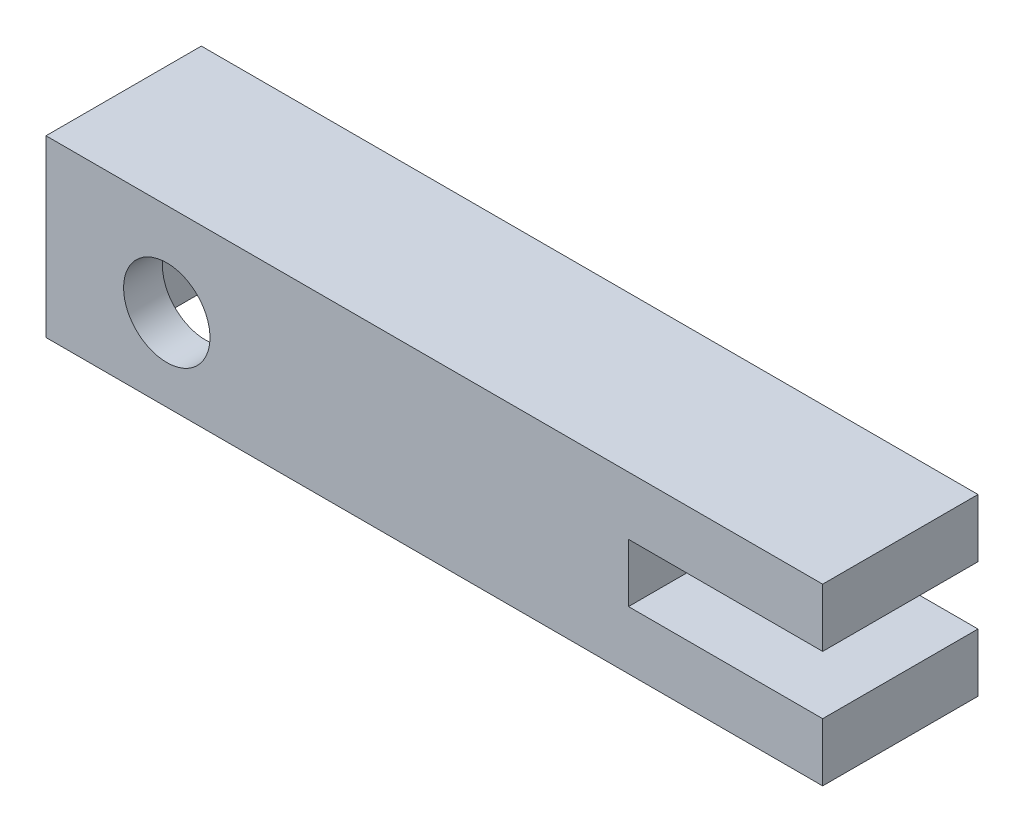
ISO-10303-21;
HEADER;
FILE_DESCRIPTION(('STEP AP214'),'2;1');
FILE_NAME('part.step','',(''),(''),'','','');
FILE_SCHEMA(('AUTOMOTIVE_DESIGN { 1 0 10303 214 1 1 1 1 }'));
ENDSEC;
DATA;
#1=APPLICATION_CONTEXT('core data for automotive mechanical design processes');
#2=APPLICATION_PROTOCOL_DEFINITION('international standard','automotive_design',2000,#1);
#3=PRODUCT_CONTEXT('',#1,'mechanical');
#4=PRODUCT('Part','Part','',(#3));
#5=PRODUCT_RELATED_PRODUCT_CATEGORY('part','',(#4));
#6=PRODUCT_DEFINITION_FORMATION('','',#4);
#7=PRODUCT_DEFINITION_CONTEXT('part definition',#1,'design');
#8=PRODUCT_DEFINITION('design','',#6,#7);
#9=PRODUCT_DEFINITION_SHAPE('','',#8);
#10=(LENGTH_UNIT() NAMED_UNIT(*) SI_UNIT(.MILLI.,.METRE.));
#11=(NAMED_UNIT(*) PLANE_ANGLE_UNIT() SI_UNIT($,.RADIAN.));
#12=(NAMED_UNIT(*) SI_UNIT($,.STERADIAN.) SOLID_ANGLE_UNIT());
#13=UNCERTAINTY_MEASURE_WITH_UNIT(LENGTH_MEASURE(1.E-05),#10,'distance_accuracy_value','');
#14=(GEOMETRIC_REPRESENTATION_CONTEXT(3) GLOBAL_UNCERTAINTY_ASSIGNED_CONTEXT((#13)) GLOBAL_UNIT_ASSIGNED_CONTEXT((#10,
#11,#12)) REPRESENTATION_CONTEXT('',''));
#15=CARTESIAN_POINT('',(0.,0.,0.));
#16=DIRECTION('',(0.,0.,1.));
#17=DIRECTION('',(1.,0.,0.));
#18=AXIS2_PLACEMENT_3D('',#15,#16,#17);
#19=CARTESIAN_POINT('',(-175.,45.,-20.));
#20=DIRECTION('',(0.,0.,1.));
#21=DIRECTION('',(1.,0.,0.));
#22=AXIS2_PLACEMENT_3D('',#19,#20,#21);
#23=PLANE('',#22);
#24=DIRECTION('',(0.,1.,0.));
#25=VECTOR('',#24,1.);
#26=CARTESIAN_POINT('',(25.,0.,-20.));
#27=LINE('',#26,#25);
#28=CARTESIAN_POINT('',(25.,30.,-20.));
#29=VERTEX_POINT('',#28);
#30=CARTESIAN_POINT('',(25.,45.,-20.));
#31=VERTEX_POINT('',#30);
#32=EDGE_CURVE('E59',#29,#31,#27,.T.);
#33=ORIENTED_EDGE('',*,*,#32,.F.);
#34=DIRECTION('',(1.,0.,0.));
#35=VECTOR('',#34,1.);
#36=CARTESIAN_POINT('',(0.,30.,-20.));
#37=LINE('',#36,#35);
#38=CARTESIAN_POINT('',(-25.,30.,-20.));
#39=VERTEX_POINT('',#38);
#40=EDGE_CURVE('E134',#39,#29,#37,.T.);
#41=ORIENTED_EDGE('',*,*,#40,.F.);
#42=DIRECTION('',(0.,1.,0.));
#43=VECTOR('',#42,1.);
#44=CARTESIAN_POINT('',(-25.,0.,-20.));
#45=LINE('',#44,#43);
#46=CARTESIAN_POINT('',(-25.,15.,-20.));
#47=VERTEX_POINT('',#46);
#48=EDGE_CURVE('E143',#47,#39,#45,.T.);
#49=ORIENTED_EDGE('',*,*,#48,.F.);
#50=DIRECTION('',(-1.,0.,0.));
#51=VECTOR('',#50,1.);
#52=CARTESIAN_POINT('',(0.,15.,-20.));
#53=LINE('',#52,#51);
#54=CARTESIAN_POINT('',(25.,15.,-20.));
#55=VERTEX_POINT('',#54);
#56=EDGE_CURVE('E165',#55,#47,#53,.T.);
#57=ORIENTED_EDGE('',*,*,#56,.F.);
#58=DIRECTION('',(0.,1.,0.));
#59=VECTOR('',#58,1.);
#60=CARTESIAN_POINT('',(25.,0.,-20.));
#61=LINE('',#60,#59);
#62=CARTESIAN_POINT('',(25.,0.,-20.));
#63=VERTEX_POINT('',#62);
#64=EDGE_CURVE('E150',#63,#55,#61,.T.);
#65=ORIENTED_EDGE('',*,*,#64,.F.);
#66=DIRECTION('',(-1.,0.,0.));
#67=VECTOR('',#66,1.);
#68=CARTESIAN_POINT('',(-175.,0.,-20.));
#69=LINE('',#68,#67);
#70=CARTESIAN_POINT('',(-122.8,0.,-20.));
#71=VERTEX_POINT('',#70);
#72=EDGE_CURVE('E254',#63,#71,#69,.T.);
#73=ORIENTED_EDGE('',*,*,#72,.T.);
#74=DIRECTION('',(0.,1.,0.));
#75=VECTOR('',#74,1.);
#76=CARTESIAN_POINT('',(-122.8,0.,-20.));
#77=LINE('',#76,#75);
#78=CARTESIAN_POINT('',(-122.8,42.2,-20.));
#79=VERTEX_POINT('',#78);
#80=EDGE_CURVE('E211',#71,#79,#77,.T.);
#81=ORIENTED_EDGE('',*,*,#80,.T.);
#82=DIRECTION('',(-1.,0.,0.));
#83=VECTOR('',#82,1.);
#84=CARTESIAN_POINT('',(-165.,42.2,-20.));
#85=LINE('',#84,#83);
#86=CARTESIAN_POINT('',(-165.,42.2,-20.));
#87=VERTEX_POINT('',#86);
#88=EDGE_CURVE('E224',#79,#87,#85,.T.);
#89=ORIENTED_EDGE('',*,*,#88,.T.);
#90=DIRECTION('',(0.,-1.,0.));
#91=VECTOR('',#90,1.);
#92=CARTESIAN_POINT('',(-165.,0.,-20.));
#93=LINE('',#92,#91);
#94=CARTESIAN_POINT('',(-165.,0.,-20.));
#95=VERTEX_POINT('',#94);
#96=EDGE_CURVE('E205',#87,#95,#93,.T.);
#97=ORIENTED_EDGE('',*,*,#96,.T.);
#98=CARTESIAN_POINT('',(-175.,0.,-20.));
#99=VERTEX_POINT('',#98);
#100=EDGE_CURVE('E234',#95,#99,#69,.T.);
#101=ORIENTED_EDGE('',*,*,#100,.T.);
#102=DIRECTION('',(0.,-1.,0.));
#103=VECTOR('',#102,1.);
#104=CARTESIAN_POINT('',(-175.,45.,-20.));
#105=LINE('',#104,#103);
#106=CARTESIAN_POINT('',(-175.,45.,-20.));
#107=VERTEX_POINT('',#106);
#108=EDGE_CURVE('E11',#107,#99,#105,.T.);
#109=ORIENTED_EDGE('',*,*,#108,.F.);
#110=DIRECTION('',(-1.,0.,0.));
#111=VECTOR('',#110,1.);
#112=CARTESIAN_POINT('',(-175.,45.,-20.));
#113=LINE('',#112,#111);
#114=EDGE_CURVE('E154',#31,#107,#113,.T.);
#115=ORIENTED_EDGE('',*,*,#114,.F.);
#116=EDGE_LOOP('',(#33,#41,#49,#57,#65,#73,#81,#89,#97,#101,#109,#115));
#117=FACE_BOUND('',#116,.T.);
#118=ADVANCED_FACE('F44',(#117),#23,.F.);
#119=CARTESIAN_POINT('',(0.,0.,0.));
#120=DIRECTION('',(0.,-1.,0.));
#121=DIRECTION('',(0.,0.,-1.));
#122=AXIS2_PLACEMENT_3D('',#119,#120,#121);
#123=PLANE('',#122);
#124=ORIENTED_EDGE('',*,*,#72,.F.);
#125=DIRECTION('',(0.,0.,1.));
#126=VECTOR('',#125,1.);
#127=CARTESIAN_POINT('',(25.,0.,-20.));
#128=LINE('',#127,#126);
#129=CARTESIAN_POINT('',(25.,0.,20.));
#130=VERTEX_POINT('',#129);
#131=EDGE_CURVE('E186',#63,#130,#128,.T.);
#132=ORIENTED_EDGE('',*,*,#131,.T.);
#133=DIRECTION('',(1.,0.,0.));
#134=VECTOR('',#133,1.);
#135=CARTESIAN_POINT('',(-175.,0.,20.));
#136=LINE('',#135,#134);
#137=CARTESIAN_POINT('',(-175.,0.,20.));
#138=VERTEX_POINT('',#137);
#139=EDGE_CURVE('E247',#138,#130,#136,.T.);
#140=ORIENTED_EDGE('',*,*,#139,.F.);
#141=DIRECTION('',(0.,0.,1.));
#142=VECTOR('',#141,1.);
#143=CARTESIAN_POINT('',(-175.,0.,20.));
#144=LINE('',#143,#142);
#145=EDGE_CURVE('E257',#99,#138,#144,.T.);
#146=ORIENTED_EDGE('',*,*,#145,.F.);
#147=ORIENTED_EDGE('',*,*,#100,.F.);
#148=DIRECTION('',(0.,0.,-1.));
#149=VECTOR('',#148,1.);
#150=CARTESIAN_POINT('',(-165.,0.,10.));
#151=LINE('',#150,#149);
#152=CARTESIAN_POINT('',(-165.,0.,10.));
#153=VERTEX_POINT('',#152);
#154=EDGE_CURVE('E231',#153,#95,#151,.T.);
#155=ORIENTED_EDGE('',*,*,#154,.F.);
#156=DIRECTION('',(1.,0.,0.));
#157=VECTOR('',#156,1.);
#158=CARTESIAN_POINT('',(-165.,0.,10.));
#159=LINE('',#158,#157);
#160=CARTESIAN_POINT('',(-122.8,0.,10.));
#161=VERTEX_POINT('',#160);
#162=EDGE_CURVE('E216',#153,#161,#159,.T.);
#163=ORIENTED_EDGE('',*,*,#162,.T.);
#164=DIRECTION('',(0.,0.,-1.));
#165=VECTOR('',#164,1.);
#166=CARTESIAN_POINT('',(-122.8,0.,10.));
#167=LINE('',#166,#165);
#168=EDGE_CURVE('E235',#161,#71,#167,.T.);
#169=ORIENTED_EDGE('',*,*,#168,.T.);
#170=EDGE_LOOP('',(#124,#132,#140,#146,#147,#155,#163,#169));
#171=FACE_BOUND('',#170,.T.);
#172=ADVANCED_FACE('F274',(#171),#123,.T.);
#173=CARTESIAN_POINT('',(-175.,45.,20.));
#174=DIRECTION('',(0.,0.,-1.));
#175=DIRECTION('',(-1.,0.,0.));
#176=AXIS2_PLACEMENT_3D('',#173,#174,#175);
#177=PLANE('',#176);
#178=CARTESIAN_POINT('',(-143.9,21.1,20.));
#179=DIRECTION('',(0.,0.,-1.));
#180=DIRECTION('',(-1.,0.,0.));
#181=AXIS2_PLACEMENT_3D('',#178,#179,#180);
#182=CIRCLE('',#181,11.125);
#183=CARTESIAN_POINT('',(-155.025,21.1,20.));
#184=VERTEX_POINT('',#183);
#185=EDGE_CURVE('E201',#184,#184,#182,.F.);
#186=ORIENTED_EDGE('',*,*,#185,.F.);
#187=EDGE_LOOP('',(#186));
#188=FACE_BOUND('',#187,.T.);
#189=DIRECTION('',(0.,1.,0.));
#190=VECTOR('',#189,1.);
#191=CARTESIAN_POINT('',(25.,0.,20.));
#192=LINE('',#191,#190);
#193=CARTESIAN_POINT('',(25.,30.,20.));
#194=VERTEX_POINT('',#193);
#195=CARTESIAN_POINT('',(25.,45.,20.));
#196=VERTEX_POINT('',#195);
#197=EDGE_CURVE('E147',#194,#196,#192,.T.);
#198=ORIENTED_EDGE('',*,*,#197,.T.);
#199=DIRECTION('',(1.,0.,0.));
#200=VECTOR('',#199,1.);
#201=CARTESIAN_POINT('',(-175.,45.,20.));
#202=LINE('',#201,#200);
#203=CARTESIAN_POINT('',(-175.,45.,20.));
#204=VERTEX_POINT('',#203);
#205=EDGE_CURVE('E250',#204,#196,#202,.T.);
#206=ORIENTED_EDGE('',*,*,#205,.F.);
#207=DIRECTION('',(0.,-1.,0.));
#208=VECTOR('',#207,1.);
#209=CARTESIAN_POINT('',(-175.,45.,20.));
#210=LINE('',#209,#208);
#211=EDGE_CURVE('E52',#204,#138,#210,.T.);
#212=ORIENTED_EDGE('',*,*,#211,.T.);
#213=ORIENTED_EDGE('',*,*,#139,.T.);
#214=DIRECTION('',(0.,1.,0.));
#215=VECTOR('',#214,1.);
#216=CARTESIAN_POINT('',(25.,0.,20.));
#217=LINE('',#216,#215);
#218=CARTESIAN_POINT('',(25.,15.,20.));
#219=VERTEX_POINT('',#218);
#220=EDGE_CURVE('E156',#130,#219,#217,.T.);
#221=ORIENTED_EDGE('',*,*,#220,.T.);
#222=DIRECTION('',(-1.,0.,0.));
#223=VECTOR('',#222,1.);
#224=CARTESIAN_POINT('',(0.,15.,20.));
#225=LINE('',#224,#223);
#226=CARTESIAN_POINT('',(-25.,15.,20.));
#227=VERTEX_POINT('',#226);
#228=EDGE_CURVE('E160',#219,#227,#225,.T.);
#229=ORIENTED_EDGE('',*,*,#228,.T.);
#230=DIRECTION('',(0.,1.,0.));
#231=VECTOR('',#230,1.);
#232=CARTESIAN_POINT('',(-25.,0.,20.));
#233=LINE('',#232,#231);
#234=CARTESIAN_POINT('',(-25.,30.,20.));
#235=VERTEX_POINT('',#234);
#236=EDGE_CURVE('E175',#227,#235,#233,.T.);
#237=ORIENTED_EDGE('',*,*,#236,.T.);
#238=DIRECTION('',(1.,0.,0.));
#239=VECTOR('',#238,1.);
#240=CARTESIAN_POINT('',(0.,30.,20.));
#241=LINE('',#240,#239);
#242=EDGE_CURVE('E172',#235,#194,#241,.T.);
#243=ORIENTED_EDGE('',*,*,#242,.T.);
#244=EDGE_LOOP('',(#198,#206,#212,#213,#221,#229,#237,#243));
#245=FACE_BOUND('',#244,.T.);
#246=ADVANCED_FACE('F268',(#188,#245),#177,.F.);
#247=CARTESIAN_POINT('',(0.,45.,0.));
#248=DIRECTION('',(0.,-1.,0.));
#249=DIRECTION('',(0.,0.,-1.));
#250=AXIS2_PLACEMENT_3D('',#247,#248,#249);
#251=PLANE('',#250);
#252=DIRECTION('',(0.,0.,1.));
#253=VECTOR('',#252,1.);
#254=CARTESIAN_POINT('',(25.,45.,-20.));
#255=LINE('',#254,#253);
#256=EDGE_CURVE('E182',#31,#196,#255,.T.);
#257=ORIENTED_EDGE('',*,*,#256,.F.);
#258=ORIENTED_EDGE('',*,*,#114,.T.);
#259=DIRECTION('',(0.,0.,1.));
#260=VECTOR('',#259,1.);
#261=CARTESIAN_POINT('',(-175.,45.,20.));
#262=LINE('',#261,#260);
#263=EDGE_CURVE('E246',#107,#204,#262,.T.);
#264=ORIENTED_EDGE('',*,*,#263,.T.);
#265=ORIENTED_EDGE('',*,*,#205,.T.);
#266=EDGE_LOOP('',(#257,#258,#264,#265));
#267=FACE_BOUND('',#266,.T.);
#268=ADVANCED_FACE('F290',(#267),#251,.F.);
#269=CARTESIAN_POINT('',(-175.,45.,20.));
#270=DIRECTION('',(1.,0.,0.));
#271=DIRECTION('',(0.,0.,-1.));
#272=AXIS2_PLACEMENT_3D('',#269,#270,#271);
#273=PLANE('',#272);
#274=ORIENTED_EDGE('',*,*,#145,.T.);
#275=ORIENTED_EDGE('',*,*,#211,.F.);
#276=ORIENTED_EDGE('',*,*,#263,.F.);
#277=ORIENTED_EDGE('',*,*,#108,.T.);
#278=EDGE_LOOP('',(#274,#275,#276,#277));
#279=FACE_BOUND('',#278,.T.);
#280=ADVANCED_FACE('F291',(#279),#273,.F.);
#281=CARTESIAN_POINT('',(-165.,0.,10.));
#282=DIRECTION('',(1.,0.,0.));
#283=DIRECTION('',(0.,0.,-1.));
#284=AXIS2_PLACEMENT_3D('',#281,#282,#283);
#285=PLANE('',#284);
#286=ORIENTED_EDGE('',*,*,#96,.F.);
#287=DIRECTION('',(0.,0.,-1.));
#288=VECTOR('',#287,1.);
#289=CARTESIAN_POINT('',(-165.,42.2,10.));
#290=LINE('',#289,#288);
#291=CARTESIAN_POINT('',(-165.,42.2,10.));
#292=VERTEX_POINT('',#291);
#293=EDGE_CURVE('E220',#292,#87,#290,.T.);
#294=ORIENTED_EDGE('',*,*,#293,.F.);
#295=DIRECTION('',(0.,-1.,0.));
#296=VECTOR('',#295,1.);
#297=CARTESIAN_POINT('',(-165.,0.,10.));
#298=LINE('',#297,#296);
#299=EDGE_CURVE('E206',#292,#153,#298,.T.);
#300=ORIENTED_EDGE('',*,*,#299,.T.);
#301=ORIENTED_EDGE('',*,*,#154,.T.);
#302=EDGE_LOOP('',(#286,#294,#300,#301));
#303=FACE_BOUND('',#302,.T.);
#304=ADVANCED_FACE('F296',(#303),#285,.T.);
#305=CARTESIAN_POINT('',(-122.8,0.,10.));
#306=DIRECTION('',(-1.,0.,0.));
#307=DIRECTION('',(0.,0.,1.));
#308=AXIS2_PLACEMENT_3D('',#305,#306,#307);
#309=PLANE('',#308);
#310=ORIENTED_EDGE('',*,*,#80,.F.);
#311=ORIENTED_EDGE('',*,*,#168,.F.);
#312=DIRECTION('',(0.,1.,0.));
#313=VECTOR('',#312,1.);
#314=CARTESIAN_POINT('',(-122.8,0.,10.));
#315=LINE('',#314,#313);
#316=CARTESIAN_POINT('',(-122.8,42.2,10.));
#317=VERTEX_POINT('',#316);
#318=EDGE_CURVE('E67',#161,#317,#315,.T.);
#319=ORIENTED_EDGE('',*,*,#318,.T.);
#320=DIRECTION('',(0.,0.,-1.));
#321=VECTOR('',#320,1.);
#322=CARTESIAN_POINT('',(-122.8,42.2,10.));
#323=LINE('',#322,#321);
#324=EDGE_CURVE('E239',#317,#79,#323,.T.);
#325=ORIENTED_EDGE('',*,*,#324,.T.);
#326=EDGE_LOOP('',(#310,#311,#319,#325));
#327=FACE_BOUND('',#326,.T.);
#328=ADVANCED_FACE('F305',(#327),#309,.T.);
#329=CARTESIAN_POINT('',(-165.,42.2,10.));
#330=DIRECTION('',(0.,-1.,0.));
#331=DIRECTION('',(0.,0.,-1.));
#332=AXIS2_PLACEMENT_3D('',#329,#330,#331);
#333=PLANE('',#332);
#334=ORIENTED_EDGE('',*,*,#88,.F.);
#335=ORIENTED_EDGE('',*,*,#324,.F.);
#336=DIRECTION('',(-1.,0.,0.));
#337=VECTOR('',#336,1.);
#338=CARTESIAN_POINT('',(-165.,42.2,10.));
#339=LINE('',#338,#337);
#340=EDGE_CURVE('E210',#317,#292,#339,.T.);
#341=ORIENTED_EDGE('',*,*,#340,.T.);
#342=ORIENTED_EDGE('',*,*,#293,.T.);
#343=EDGE_LOOP('',(#334,#335,#341,#342));
#344=FACE_BOUND('',#343,.T.);
#345=ADVANCED_FACE('F303',(#344),#333,.T.);
#346=CARTESIAN_POINT('',(0.,0.,10.));
#347=DIRECTION('',(0.,0.,1.));
#348=DIRECTION('',(-1.,0.,0.));
#349=AXIS2_PLACEMENT_3D('',#346,#347,#348);
#350=PLANE('',#349);
#351=CARTESIAN_POINT('',(-143.9,21.1,10.));
#352=DIRECTION('',(0.,0.,1.));
#353=DIRECTION('',(1.,0.,0.));
#354=AXIS2_PLACEMENT_3D('',#351,#352,#353);
#355=CIRCLE('',#354,11.125);
#356=CARTESIAN_POINT('',(-132.775,21.1,10.));
#357=VERTEX_POINT('',#356);
#358=EDGE_CURVE('E185',#357,#357,#355,.T.);
#359=ORIENTED_EDGE('',*,*,#358,.T.);
#360=EDGE_LOOP('',(#359));
#361=FACE_BOUND('',#360,.T.);
#362=ORIENTED_EDGE('',*,*,#299,.F.);
#363=ORIENTED_EDGE('',*,*,#340,.F.);
#364=ORIENTED_EDGE('',*,*,#318,.F.);
#365=ORIENTED_EDGE('',*,*,#162,.F.);
#366=EDGE_LOOP('',(#362,#363,#364,#365));
#367=FACE_BOUND('',#366,.T.);
#368=ADVANCED_FACE('F299',(#361,#367),#350,.F.);
#369=CARTESIAN_POINT('',(-143.9,21.1,40.));
#370=DIRECTION('',(0.,0.,-1.));
#371=DIRECTION('',(-1.,0.,0.));
#372=AXIS2_PLACEMENT_3D('',#369,#370,#371);
#373=CYLINDRICAL_SURFACE('',#372,11.125);
#374=ORIENTED_EDGE('',*,*,#358,.F.);
#375=EDGE_LOOP('',(#374));
#376=FACE_BOUND('',#375,.T.);
#377=ORIENTED_EDGE('',*,*,#185,.T.);
#378=EDGE_LOOP('',(#377));
#379=FACE_BOUND('',#378,.T.);
#380=ADVANCED_FACE('F342',(#376,#379),#373,.F.);
#381=CARTESIAN_POINT('',(25.,0.,-20.));
#382=DIRECTION('',(1.,0.,0.));
#383=DIRECTION('',(0.,1.,0.));
#384=AXIS2_PLACEMENT_3D('',#381,#382,#383);
#385=PLANE('',#384);
#386=ORIENTED_EDGE('',*,*,#197,.F.);
#387=DIRECTION('',(0.,0.,1.));
#388=VECTOR('',#387,1.);
#389=CARTESIAN_POINT('',(25.,30.,-20.));
#390=LINE('',#389,#388);
#391=EDGE_CURVE('E137',#29,#194,#390,.T.);
#392=ORIENTED_EDGE('',*,*,#391,.F.);
#393=ORIENTED_EDGE('',*,*,#32,.T.);
#394=ORIENTED_EDGE('',*,*,#256,.T.);
#395=EDGE_LOOP('',(#386,#392,#393,#394));
#396=FACE_BOUND('',#395,.T.);
#397=ADVANCED_FACE('F145',(#396),#385,.T.);
#398=CARTESIAN_POINT('',(25.,0.,-20.));
#399=DIRECTION('',(1.,0.,0.));
#400=DIRECTION('',(0.,1.,0.));
#401=AXIS2_PLACEMENT_3D('',#398,#399,#400);
#402=PLANE('',#401);
#403=ORIENTED_EDGE('',*,*,#220,.F.);
#404=ORIENTED_EDGE('',*,*,#131,.F.);
#405=ORIENTED_EDGE('',*,*,#64,.T.);
#406=DIRECTION('',(0.,0.,1.));
#407=VECTOR('',#406,1.);
#408=CARTESIAN_POINT('',(25.,15.,-20.));
#409=LINE('',#408,#407);
#410=EDGE_CURVE('E190',#55,#219,#409,.T.);
#411=ORIENTED_EDGE('',*,*,#410,.T.);
#412=EDGE_LOOP('',(#403,#404,#405,#411));
#413=FACE_BOUND('',#412,.T.);
#414=ADVANCED_FACE('F278',(#413),#402,.T.);
#415=CARTESIAN_POINT('',(0.,15.,-20.));
#416=DIRECTION('',(0.,1.,0.));
#417=DIRECTION('',(-1.,0.,0.));
#418=AXIS2_PLACEMENT_3D('',#415,#416,#417);
#419=PLANE('',#418);
#420=ORIENTED_EDGE('',*,*,#228,.F.);
#421=ORIENTED_EDGE('',*,*,#410,.F.);
#422=ORIENTED_EDGE('',*,*,#56,.T.);
#423=DIRECTION('',(0.,0.,1.));
#424=VECTOR('',#423,1.);
#425=CARTESIAN_POINT('',(-25.,15.,-20.));
#426=LINE('',#425,#424);
#427=EDGE_CURVE('E193',#47,#227,#426,.T.);
#428=ORIENTED_EDGE('',*,*,#427,.T.);
#429=EDGE_LOOP('',(#420,#421,#422,#428));
#430=FACE_BOUND('',#429,.T.);
#431=ADVANCED_FACE('F285',(#430),#419,.T.);
#432=CARTESIAN_POINT('',(-25.,0.,-20.));
#433=DIRECTION('',(1.,0.,0.));
#434=DIRECTION('',(0.,1.,0.));
#435=AXIS2_PLACEMENT_3D('',#432,#433,#434);
#436=PLANE('',#435);
#437=ORIENTED_EDGE('',*,*,#236,.F.);
#438=ORIENTED_EDGE('',*,*,#427,.F.);
#439=ORIENTED_EDGE('',*,*,#48,.T.);
#440=DIRECTION('',(0.,0.,1.));
#441=VECTOR('',#440,1.);
#442=CARTESIAN_POINT('',(-25.,30.,-20.));
#443=LINE('',#442,#441);
#444=EDGE_CURVE('E139',#39,#235,#443,.T.);
#445=ORIENTED_EDGE('',*,*,#444,.T.);
#446=EDGE_LOOP('',(#437,#438,#439,#445));
#447=FACE_BOUND('',#446,.T.);
#448=ADVANCED_FACE('F288',(#447),#436,.T.);
#449=CARTESIAN_POINT('',(0.,30.,-20.));
#450=DIRECTION('',(0.,-1.,0.));
#451=DIRECTION('',(0.,0.,-1.));
#452=AXIS2_PLACEMENT_3D('',#449,#450,#451);
#453=PLANE('',#452);
#454=ORIENTED_EDGE('',*,*,#242,.F.);
#455=ORIENTED_EDGE('',*,*,#444,.F.);
#456=ORIENTED_EDGE('',*,*,#40,.T.);
#457=ORIENTED_EDGE('',*,*,#391,.T.);
#458=EDGE_LOOP('',(#454,#455,#456,#457));
#459=FACE_BOUND('',#458,.T.);
#460=ADVANCED_FACE('F136',(#459),#453,.T.);
#461=CLOSED_SHELL('',(#118,#172,#246,#268,#280,#304,#328,#345,#368,#380,#397,#414,#431,#448,#460));
#462=MANIFOLD_SOLID_BREP('B2',#461);
#463=ADVANCED_BREP_SHAPE_REPRESENTATION('',(#18,#462),#14);
#464=SHAPE_DEFINITION_REPRESENTATION(#9,#463);
ENDSEC;
END-ISO-10303-21;
